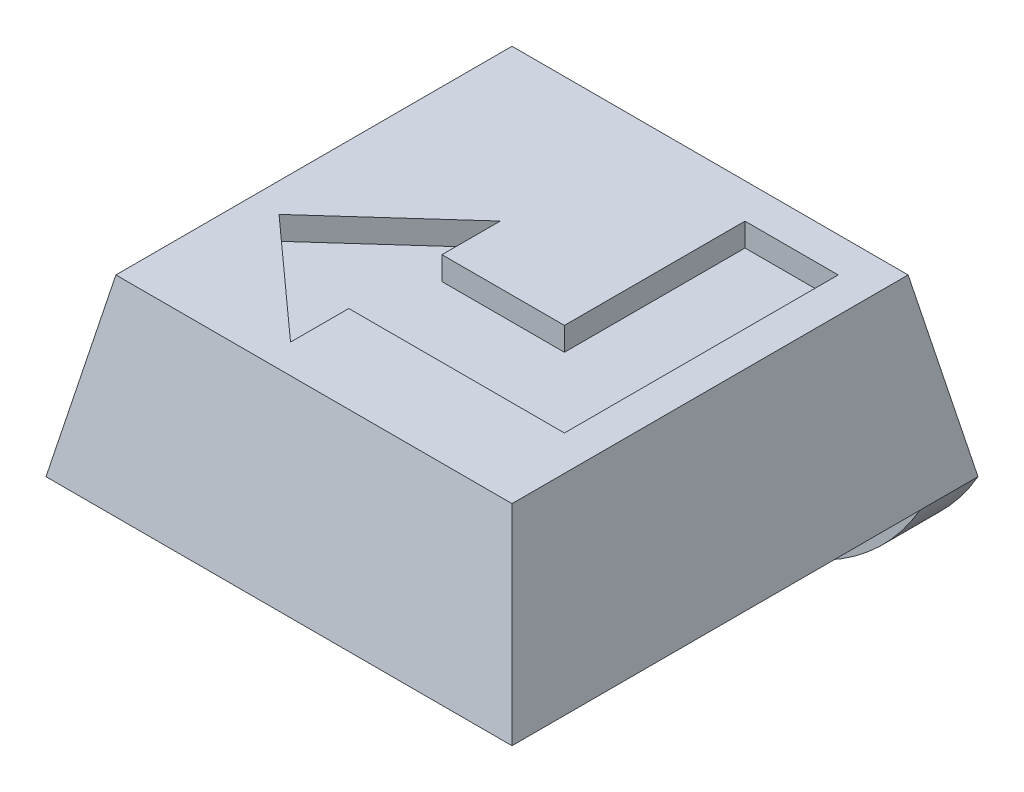
ISO-10303-21;
HEADER;
FILE_DESCRIPTION(('STEP AP214'),'2;1');
FILE_NAME('part.step','',(''),(''),'','','');
FILE_SCHEMA(('AUTOMOTIVE_DESIGN { 1 0 10303 214 1 1 1 1 }'));
ENDSEC;
DATA;
#1=APPLICATION_CONTEXT('core data for automotive mechanical design processes');
#2=APPLICATION_PROTOCOL_DEFINITION('international standard','automotive_design',2000,#1);
#3=PRODUCT_CONTEXT('',#1,'mechanical');
#4=PRODUCT('Part','Part','',(#3));
#5=PRODUCT_RELATED_PRODUCT_CATEGORY('part','',(#4));
#6=PRODUCT_DEFINITION_FORMATION('','',#4);
#7=PRODUCT_DEFINITION_CONTEXT('part definition',#1,'design');
#8=PRODUCT_DEFINITION('design','',#6,#7);
#9=PRODUCT_DEFINITION_SHAPE('','',#8);
#10=(LENGTH_UNIT() NAMED_UNIT(*) SI_UNIT(.MILLI.,.METRE.));
#11=(NAMED_UNIT(*) PLANE_ANGLE_UNIT() SI_UNIT($,.RADIAN.));
#12=(NAMED_UNIT(*) SI_UNIT($,.STERADIAN.) SOLID_ANGLE_UNIT());
#13=UNCERTAINTY_MEASURE_WITH_UNIT(LENGTH_MEASURE(1.E-05),#10,'distance_accuracy_value','');
#14=(GEOMETRIC_REPRESENTATION_CONTEXT(3) GLOBAL_UNCERTAINTY_ASSIGNED_CONTEXT((#13)) GLOBAL_UNIT_ASSIGNED_CONTEXT((#10,
#11,#12)) REPRESENTATION_CONTEXT('',''));
#15=CARTESIAN_POINT('',(0.,0.,0.));
#16=DIRECTION('',(0.,0.,1.));
#17=DIRECTION('',(1.,0.,0.));
#18=AXIS2_PLACEMENT_3D('',#15,#16,#17);
#19=CARTESIAN_POINT('',(0.,3.,0.));
#20=DIRECTION('',(0.,-1.,0.));
#21=DIRECTION('',(0.,0.,-1.));
#22=AXIS2_PLACEMENT_3D('',#19,#20,#21);
#23=PLANE('',#22);
#24=DIRECTION('',(-1.,0.,0.));
#25=VECTOR('',#24,1.);
#26=CARTESIAN_POINT('',(0.,3.,-2.1));
#27=LINE('',#26,#25);
#28=CARTESIAN_POINT('',(6.8,3.,-2.1));
#29=VERTEX_POINT('',#28);
#30=CARTESIAN_POINT('',(3.09782784027759,3.,-2.1));
#31=VERTEX_POINT('',#30);
#32=EDGE_CURVE('E239',#29,#31,#27,.T.);
#33=ORIENTED_EDGE('',*,*,#32,.T.);
#34=DIRECTION('',(0.,0.,-1.));
#35=VECTOR('',#34,1.);
#36=CARTESIAN_POINT('',(3.09782784027759,3.,0.));
#37=LINE('',#36,#35);
#38=CARTESIAN_POINT('',(3.09782784027759,3.,-1.1));
#39=VERTEX_POINT('',#38);
#40=EDGE_CURVE('E235',#39,#31,#37,.T.);
#41=ORIENTED_EDGE('',*,*,#40,.F.);
#42=DIRECTION('',(0.742932553355282,0.,0.669366283259772));
#43=VECTOR('',#42,1.);
#44=CARTESIAN_POINT('',(1.93500894894264,3.,-2.14767486076882));
#45=LINE('',#44,#43);
#46=CARTESIAN_POINT('',(1.1,3.,-2.9));
#47=VERTEX_POINT('',#46);
#48=EDGE_CURVE('E197',#47,#39,#45,.T.);
#49=ORIENTED_EDGE('',*,*,#48,.F.);
#50=DIRECTION('',(-0.742932553355282,0.,0.669366283259772));
#51=VECTOR('',#50,1.);
#52=CARTESIAN_POINT('',(-0.949296262379639,3.,-1.05362805647417));
#53=LINE('',#52,#51);
#54=CARTESIAN_POINT('',(3.09782784027759,3.,-4.7));
#55=VERTEX_POINT('',#54);
#56=EDGE_CURVE('E218',#55,#47,#53,.T.);
#57=ORIENTED_EDGE('',*,*,#56,.F.);
#58=CARTESIAN_POINT('',(3.09782784027759,3.,-3.7));
#59=VERTEX_POINT('',#58);
#60=EDGE_CURVE('E222',#59,#55,#37,.T.);
#61=ORIENTED_EDGE('',*,*,#60,.F.);
#62=DIRECTION('',(-1.,0.,0.));
#63=VECTOR('',#62,1.);
#64=CARTESIAN_POINT('',(0.,3.,-3.7));
#65=LINE('',#64,#63);
#66=CARTESIAN_POINT('',(5.2,3.,-3.7));
#67=VERTEX_POINT('',#66);
#68=EDGE_CURVE('E243',#67,#59,#65,.T.);
#69=ORIENTED_EDGE('',*,*,#68,.F.);
#70=DIRECTION('',(0.,0.,1.));
#71=VECTOR('',#70,1.);
#72=CARTESIAN_POINT('',(5.2,3.,-6.8));
#73=LINE('',#72,#71);
#74=CARTESIAN_POINT('',(5.2,3.,-6.8));
#75=VERTEX_POINT('',#74);
#76=EDGE_CURVE('E267',#75,#67,#73,.T.);
#77=ORIENTED_EDGE('',*,*,#76,.F.);
#78=DIRECTION('',(1.,0.,0.));
#79=VECTOR('',#78,1.);
#80=CARTESIAN_POINT('',(5.2,3.,-6.8));
#81=LINE('',#80,#79);
#82=CARTESIAN_POINT('',(6.8,3.,-6.8));
#83=VERTEX_POINT('',#82);
#84=EDGE_CURVE('E91',#75,#83,#81,.T.);
#85=ORIENTED_EDGE('',*,*,#84,.T.);
#86=DIRECTION('',(0.,0.,1.));
#87=VECTOR('',#86,1.);
#88=CARTESIAN_POINT('',(6.8,3.,-6.8));
#89=LINE('',#88,#87);
#90=EDGE_CURVE('E275',#83,#29,#89,.T.);
#91=ORIENTED_EDGE('',*,*,#90,.T.);
#92=EDGE_LOOP('',(#33,#41,#49,#57,#61,#69,#77,#85,#91));
#93=FACE_BOUND('',#92,.T.);
#94=DIRECTION('',(-1.,0.,0.));
#95=VECTOR('',#94,1.);
#96=CARTESIAN_POINT('',(11.,3.,-0.6));
#97=LINE('',#96,#95);
#98=CARTESIAN_POINT('',(7.4,3.,-0.6));
#99=VERTEX_POINT('',#98);
#100=CARTESIAN_POINT('',(0.6,3.,-0.6));
#101=VERTEX_POINT('',#100);
#102=EDGE_CURVE('E314',#99,#101,#97,.T.);
#103=ORIENTED_EDGE('',*,*,#102,.F.);
#104=DIRECTION('',(0.,0.,1.));
#105=VECTOR('',#104,1.);
#106=CARTESIAN_POINT('',(7.4,3.,-8.));
#107=LINE('',#106,#105);
#108=CARTESIAN_POINT('',(7.4,3.,-7.4));
#109=VERTEX_POINT('',#108);
#110=EDGE_CURVE('E327',#109,#99,#107,.T.);
#111=ORIENTED_EDGE('',*,*,#110,.F.);
#112=DIRECTION('',(-1.,0.,0.));
#113=VECTOR('',#112,1.);
#114=CARTESIAN_POINT('',(11.,3.,-7.4));
#115=LINE('',#114,#113);
#116=CARTESIAN_POINT('',(0.599999999999999,3.,-7.4));
#117=VERTEX_POINT('',#116);
#118=EDGE_CURVE('E310',#109,#117,#115,.T.);
#119=ORIENTED_EDGE('',*,*,#118,.T.);
#120=DIRECTION('',(0.,0.,1.));
#121=VECTOR('',#120,1.);
#122=CARTESIAN_POINT('',(0.6,3.,-8.));
#123=LINE('',#122,#121);
#124=EDGE_CURVE('E330',#117,#101,#123,.T.);
#125=ORIENTED_EDGE('',*,*,#124,.T.);
#126=EDGE_LOOP('',(#103,#111,#119,#125));
#127=FACE_BOUND('',#126,.T.);
#128=ADVANCED_FACE('F75',(#93,#127),#23,.F.);
#129=CARTESIAN_POINT('',(8.,0.,-8.));
#130=DIRECTION('',(-0.98058067569092,-0.196116135138184,0.));
#131=DIRECTION('',(0.196116135138184,-0.98058067569092,0.));
#132=AXIS2_PLACEMENT_3D('',#129,#130,#131);
#133=PLANE('',#132);
#134=DIRECTION('',(-0.192450089729875,0.962250448649376,-0.192450089729875));
#135=VECTOR('',#134,1.);
#136=CARTESIAN_POINT('',(7.7037037037037,1.48148148148148,-0.296296296296296));
#137=LINE('',#136,#135);
#138=CARTESIAN_POINT('',(8.,0.,0.));
#139=VERTEX_POINT('',#138);
#140=EDGE_CURVE('E324',#139,#99,#137,.T.);
#141=ORIENTED_EDGE('',*,*,#140,.F.);
#142=DIRECTION('',(0.,0.,-1.));
#143=VECTOR('',#142,1.);
#144=CARTESIAN_POINT('',(8.,0.,0.));
#145=LINE('',#144,#143);
#146=CARTESIAN_POINT('',(8.,0.,-7.));
#147=VERTEX_POINT('',#146);
#148=EDGE_CURVE('E343',#139,#147,#145,.T.);
#149=ORIENTED_EDGE('',*,*,#148,.T.);
#150=DIRECTION('',(0.,0.,1.));
#151=VECTOR('',#150,1.);
#152=CARTESIAN_POINT('',(8.,0.,-8.));
#153=LINE('',#152,#151);
#154=CARTESIAN_POINT('',(8.,0.,-8.));
#155=VERTEX_POINT('',#154);
#156=EDGE_CURVE('E250',#155,#147,#153,.T.);
#157=ORIENTED_EDGE('',*,*,#156,.F.);
#158=DIRECTION('',(0.192450089729875,-0.962250448649376,-0.192450089729875));
#159=VECTOR('',#158,1.);
#160=CARTESIAN_POINT('',(8.,0.,-8.));
#161=LINE('',#160,#159);
#162=EDGE_CURVE('E317',#109,#155,#161,.T.);
#163=ORIENTED_EDGE('',*,*,#162,.F.);
#164=ORIENTED_EDGE('',*,*,#110,.T.);
#165=EDGE_LOOP('',(#141,#149,#157,#163,#164));
#166=FACE_BOUND('',#165,.T.);
#167=ADVANCED_FACE('F411',(#166),#133,.F.);
#168=CARTESIAN_POINT('',(0.,0.,-8.));
#169=DIRECTION('',(0.98058067569092,-0.196116135138184,0.));
#170=DIRECTION('',(0.196116135138184,0.98058067569092,0.));
#171=AXIS2_PLACEMENT_3D('',#168,#169,#170);
#172=PLANE('',#171);
#173=DIRECTION('',(-0.192450089729875,-0.962250448649376,0.192450089729875));
#174=VECTOR('',#173,1.);
#175=CARTESIAN_POINT('',(0.296296296296296,1.48148148148148,-0.296296296296296));
#176=LINE('',#175,#174);
#177=CARTESIAN_POINT('',(0.,0.,0.));
#178=VERTEX_POINT('',#177);
#179=EDGE_CURVE('E371',#101,#178,#176,.T.);
#180=ORIENTED_EDGE('',*,*,#179,.F.);
#181=ORIENTED_EDGE('',*,*,#124,.F.);
#182=DIRECTION('',(0.192450089729875,0.962250448649376,0.192450089729875));
#183=VECTOR('',#182,1.);
#184=CARTESIAN_POINT('',(0.,0.,-8.));
#185=LINE('',#184,#183);
#186=CARTESIAN_POINT('',(0.,0.,-8.));
#187=VERTEX_POINT('',#186);
#188=EDGE_CURVE('E342',#187,#117,#185,.T.);
#189=ORIENTED_EDGE('',*,*,#188,.F.);
#190=DIRECTION('',(0.,0.,1.));
#191=VECTOR('',#190,1.);
#192=CARTESIAN_POINT('',(0.,0.,0.));
#193=LINE('',#192,#191);
#194=CARTESIAN_POINT('',(0.,0.,-7.));
#195=VERTEX_POINT('',#194);
#196=EDGE_CURVE('E347',#187,#195,#193,.T.);
#197=ORIENTED_EDGE('',*,*,#196,.T.);
#198=EDGE_CURVE('E334',#195,#178,#193,.T.);
#199=ORIENTED_EDGE('',*,*,#198,.T.);
#200=EDGE_LOOP('',(#180,#181,#189,#197,#199));
#201=FACE_BOUND('',#200,.T.);
#202=ADVANCED_FACE('F395',(#201),#172,.F.);
#203=CARTESIAN_POINT('',(0.,0.,0.));
#204=DIRECTION('',(0.,-1.,0.));
#205=DIRECTION('',(0.,0.,-1.));
#206=AXIS2_PLACEMENT_3D('',#203,#204,#205);
#207=PLANE('',#206);
#208=DIRECTION('',(-1.,0.,0.));
#209=VECTOR('',#208,1.);
#210=CARTESIAN_POINT('',(0.,0.,-7.));
#211=LINE('',#210,#209);
#212=EDGE_CURVE('E297',#147,#195,#211,.T.);
#213=ORIENTED_EDGE('',*,*,#212,.F.);
#214=ORIENTED_EDGE('',*,*,#148,.F.);
#215=DIRECTION('',(1.,0.,0.));
#216=VECTOR('',#215,1.);
#217=CARTESIAN_POINT('',(0.,0.,0.));
#218=LINE('',#217,#216);
#219=EDGE_CURVE('E344',#178,#139,#218,.T.);
#220=ORIENTED_EDGE('',*,*,#219,.F.);
#221=ORIENTED_EDGE('',*,*,#198,.F.);
#222=EDGE_LOOP('',(#213,#214,#220,#221));
#223=FACE_BOUND('',#222,.T.);
#224=CARTESIAN_POINT('',(4.,0.,-3.75));
#225=DIRECTION('',(0.,-1.,0.));
#226=DIRECTION('',(0.,0.,-1.));
#227=AXIS2_PLACEMENT_3D('',#224,#225,#226);
#228=CIRCLE('',#227,1.8);
#229=CARTESIAN_POINT('',(4.,0.,-5.55));
#230=VERTEX_POINT('',#229);
#231=EDGE_CURVE('E300',#230,#230,#228,.T.);
#232=ORIENTED_EDGE('',*,*,#231,.F.);
#233=EDGE_LOOP('',(#232));
#234=FACE_BOUND('',#233,.T.);
#235=ADVANCED_FACE('F406',(#223,#234),#207,.T.);
#236=CARTESIAN_POINT('',(11.,3.,-7.4));
#237=DIRECTION('',(0.,0.196116135138184,-0.98058067569092));
#238=DIRECTION('',(0.,0.98058067569092,0.196116135138184));
#239=AXIS2_PLACEMENT_3D('',#236,#237,#238);
#240=PLANE('',#239);
#241=ORIENTED_EDGE('',*,*,#162,.T.);
#242=DIRECTION('',(-1.,0.,0.));
#243=VECTOR('',#242,1.);
#244=CARTESIAN_POINT('',(0.,0.,-8.));
#245=LINE('',#244,#243);
#246=EDGE_CURVE('E338',#155,#187,#245,.T.);
#247=ORIENTED_EDGE('',*,*,#246,.T.);
#248=ORIENTED_EDGE('',*,*,#188,.T.);
#249=ORIENTED_EDGE('',*,*,#118,.F.);
#250=EDGE_LOOP('',(#241,#247,#248,#249));
#251=FACE_BOUND('',#250,.T.);
#252=ADVANCED_FACE('F390',(#251),#240,.T.);
#253=CARTESIAN_POINT('',(11.,0.,0.));
#254=DIRECTION('',(0.,0.196116135138184,0.98058067569092));
#255=DIRECTION('',(0.,-0.98058067569092,0.196116135138184));
#256=AXIS2_PLACEMENT_3D('',#253,#254,#255);
#257=PLANE('',#256);
#258=ORIENTED_EDGE('',*,*,#140,.T.);
#259=ORIENTED_EDGE('',*,*,#102,.T.);
#260=ORIENTED_EDGE('',*,*,#179,.T.);
#261=ORIENTED_EDGE('',*,*,#219,.T.);
#262=EDGE_LOOP('',(#258,#259,#260,#261));
#263=FACE_BOUND('',#262,.T.);
#264=ADVANCED_FACE('F437',(#263),#257,.T.);
#265=CARTESIAN_POINT('',(4.,0.8,-3.75));
#266=DIRECTION('',(0.,-1.,0.));
#267=DIRECTION('',(0.,0.,-1.));
#268=AXIS2_PLACEMENT_3D('',#265,#266,#267);
#269=CYLINDRICAL_SURFACE('',#268,1.8);
#270=CARTESIAN_POINT('',(4.,0.8,-3.75));
#271=DIRECTION('',(0.,-1.,0.));
#272=DIRECTION('',(0.,0.,-1.));
#273=AXIS2_PLACEMENT_3D('',#270,#271,#272);
#274=CIRCLE('',#273,1.8);
#275=CARTESIAN_POINT('',(4.,0.8,-5.55));
#276=VERTEX_POINT('',#275);
#277=EDGE_CURVE('E306',#276,#276,#274,.T.);
#278=ORIENTED_EDGE('',*,*,#277,.F.);
#279=EDGE_LOOP('',(#278));
#280=FACE_BOUND('',#279,.T.);
#281=ORIENTED_EDGE('',*,*,#231,.T.);
#282=EDGE_LOOP('',(#281));
#283=FACE_BOUND('',#282,.T.);
#284=ADVANCED_FACE('F444',(#280,#283),#269,.F.);
#285=CARTESIAN_POINT('',(4.,0.8,-3.75));
#286=DIRECTION('',(0.,-1.,0.));
#287=DIRECTION('',(0.,0.,-1.));
#288=AXIS2_PLACEMENT_3D('',#285,#286,#287);
#289=PLANE('',#288);
#290=ORIENTED_EDGE('',*,*,#277,.T.);
#291=EDGE_LOOP('',(#290));
#292=FACE_BOUND('',#291,.T.);
#293=ADVANCED_FACE('F448',(#292),#289,.T.);
#294=CARTESIAN_POINT('',(0.,-2.,-8.));
#295=DIRECTION('',(0.,0.,1.));
#296=DIRECTION('',(1.,0.,0.));
#297=AXIS2_PLACEMENT_3D('',#294,#295,#296);
#298=PLANE('',#297);
#299=ORIENTED_EDGE('',*,*,#246,.F.);
#300=CARTESIAN_POINT('',(4.53589838486225,2.,-8.));
#301=DIRECTION('',(0.,0.,1.));
#302=DIRECTION('',(1.,0.,0.));
#303=AXIS2_PLACEMENT_3D('',#300,#301,#302);
#304=CIRCLE('',#303,4.);
#305=CARTESIAN_POINT('',(4.53589838486225,-2.,-8.));
#306=VERTEX_POINT('',#305);
#307=EDGE_CURVE('E12',#155,#306,#304,.F.);
#308=ORIENTED_EDGE('',*,*,#307,.T.);
#309=DIRECTION('',(1.,0.,0.));
#310=VECTOR('',#309,1.);
#311=CARTESIAN_POINT('',(0.,-2.,-8.));
#312=LINE('',#311,#310);
#313=CARTESIAN_POINT('',(3.46410161513775,-2.,-8.));
#314=VERTEX_POINT('',#313);
#315=EDGE_CURVE('E292',#314,#306,#312,.T.);
#316=ORIENTED_EDGE('',*,*,#315,.F.);
#317=CARTESIAN_POINT('',(3.46410161513775,2.,-8.));
#318=DIRECTION('',(0.,0.,1.));
#319=DIRECTION('',(1.,0.,0.));
#320=AXIS2_PLACEMENT_3D('',#317,#318,#319);
#321=CIRCLE('',#320,4.);
#322=EDGE_CURVE('E84',#314,#187,#321,.F.);
#323=ORIENTED_EDGE('',*,*,#322,.T.);
#324=EDGE_LOOP('',(#299,#308,#316,#323));
#325=FACE_BOUND('',#324,.T.);
#326=ADVANCED_FACE('F383',(#325),#298,.F.);
#327=CARTESIAN_POINT('',(0.,-2.,-7.));
#328=DIRECTION('',(0.,0.,-1.));
#329=DIRECTION('',(-1.,0.,0.));
#330=AXIS2_PLACEMENT_3D('',#327,#328,#329);
#331=PLANE('',#330);
#332=DIRECTION('',(-1.,0.,0.));
#333=VECTOR('',#332,1.);
#334=CARTESIAN_POINT('',(0.,-2.,-7.));
#335=LINE('',#334,#333);
#336=CARTESIAN_POINT('',(4.53589838486225,-2.,-7.));
#337=VERTEX_POINT('',#336);
#338=CARTESIAN_POINT('',(3.46410161513775,-2.,-7.));
#339=VERTEX_POINT('',#338);
#340=EDGE_CURVE('E296',#337,#339,#335,.T.);
#341=ORIENTED_EDGE('',*,*,#340,.F.);
#342=CARTESIAN_POINT('',(4.53589838486225,2.,-7.));
#343=DIRECTION('',(0.,0.,-1.));
#344=DIRECTION('',(-1.,0.,0.));
#345=AXIS2_PLACEMENT_3D('',#342,#343,#344);
#346=CIRCLE('',#345,4.);
#347=EDGE_CURVE('E377',#337,#147,#346,.F.);
#348=ORIENTED_EDGE('',*,*,#347,.T.);
#349=ORIENTED_EDGE('',*,*,#212,.T.);
#350=CARTESIAN_POINT('',(3.46410161513775,2.,-7.));
#351=DIRECTION('',(0.,0.,-1.));
#352=DIRECTION('',(-1.,0.,0.));
#353=AXIS2_PLACEMENT_3D('',#350,#351,#352);
#354=CIRCLE('',#353,4.);
#355=EDGE_CURVE('E99',#195,#339,#354,.F.);
#356=ORIENTED_EDGE('',*,*,#355,.T.);
#357=EDGE_LOOP('',(#341,#348,#349,#356));
#358=FACE_BOUND('',#357,.T.);
#359=ADVANCED_FACE('F401',(#358),#331,.F.);
#360=CARTESIAN_POINT('',(0.,-2.,0.));
#361=DIRECTION('',(0.,1.,0.));
#362=DIRECTION('',(0.,0.,1.));
#363=AXIS2_PLACEMENT_3D('',#360,#361,#362);
#364=PLANE('',#363);
#365=ORIENTED_EDGE('',*,*,#315,.T.);
#366=DIRECTION('',(0.,0.,1.));
#367=VECTOR('',#366,1.);
#368=CARTESIAN_POINT('',(4.53589838486225,-2.,0.));
#369=LINE('',#368,#367);
#370=EDGE_CURVE('E370',#306,#337,#369,.T.);
#371=ORIENTED_EDGE('',*,*,#370,.T.);
#372=ORIENTED_EDGE('',*,*,#340,.T.);
#373=DIRECTION('',(0.,0.,-1.));
#374=VECTOR('',#373,1.);
#375=CARTESIAN_POINT('',(3.46410161513775,-2.,0.));
#376=LINE('',#375,#374);
#377=EDGE_CURVE('E366',#339,#314,#376,.T.);
#378=ORIENTED_EDGE('',*,*,#377,.T.);
#379=EDGE_LOOP('',(#365,#371,#372,#378));
#380=FACE_BOUND('',#379,.T.);
#381=ADVANCED_FACE('F399',(#380),#364,.F.);
#382=CARTESIAN_POINT('',(4.53589838486225,2.,-8.));
#383=DIRECTION('',(0.,0.,1.));
#384=DIRECTION('',(1.,0.,0.));
#385=AXIS2_PLACEMENT_3D('',#382,#383,#384);
#386=CYLINDRICAL_SURFACE('',#385,4.);
#387=ORIENTED_EDGE('',*,*,#307,.F.);
#388=ORIENTED_EDGE('',*,*,#156,.T.);
#389=ORIENTED_EDGE('',*,*,#347,.F.);
#390=ORIENTED_EDGE('',*,*,#370,.F.);
#391=EDGE_LOOP('',(#387,#388,#389,#390));
#392=FACE_BOUND('',#391,.T.);
#393=ADVANCED_FACE('F412',(#392),#386,.T.);
#394=CARTESIAN_POINT('',(3.46410161513775,2.,-8.));
#395=DIRECTION('',(0.,0.,-1.));
#396=DIRECTION('',(-1.,0.,0.));
#397=AXIS2_PLACEMENT_3D('',#394,#395,#396);
#398=CYLINDRICAL_SURFACE('',#397,4.);
#399=ORIENTED_EDGE('',*,*,#355,.F.);
#400=ORIENTED_EDGE('',*,*,#196,.F.);
#401=ORIENTED_EDGE('',*,*,#322,.F.);
#402=ORIENTED_EDGE('',*,*,#377,.F.);
#403=EDGE_LOOP('',(#399,#400,#401,#402));
#404=FACE_BOUND('',#403,.T.);
#405=ADVANCED_FACE('F77',(#404),#398,.T.);
#406=CARTESIAN_POINT('',(1.93500894894264,2.6,-2.14767486076882));
#407=DIRECTION('',(-0.669366283259772,0.,0.742932553355282));
#408=DIRECTION('',(0.742932553355282,0.,0.669366283259772));
#409=AXIS2_PLACEMENT_3D('',#406,#407,#408);
#410=PLANE('',#409);
#411=ORIENTED_EDGE('',*,*,#48,.T.);
#412=DIRECTION('',(0.,1.,0.));
#413=VECTOR('',#412,1.);
#414=CARTESIAN_POINT('',(3.09782784027759,2.6,-1.1));
#415=LINE('',#414,#413);
#416=CARTESIAN_POINT('',(3.09782784027759,2.6,-1.1));
#417=VERTEX_POINT('',#416);
#418=EDGE_CURVE('E190',#417,#39,#415,.T.);
#419=ORIENTED_EDGE('',*,*,#418,.F.);
#420=DIRECTION('',(0.742932553355282,0.,0.669366283259772));
#421=VECTOR('',#420,1.);
#422=CARTESIAN_POINT('',(1.93500894894264,2.6,-2.14767486076882));
#423=LINE('',#422,#421);
#424=CARTESIAN_POINT('',(1.1,2.6,-2.9));
#425=VERTEX_POINT('',#424);
#426=EDGE_CURVE('E194',#425,#417,#423,.T.);
#427=ORIENTED_EDGE('',*,*,#426,.F.);
#428=DIRECTION('',(0.,1.,0.));
#429=VECTOR('',#428,1.);
#430=CARTESIAN_POINT('',(1.1,2.6,-2.9));
#431=LINE('',#430,#429);
#432=EDGE_CURVE('E247',#425,#47,#431,.T.);
#433=ORIENTED_EDGE('',*,*,#432,.T.);
#434=EDGE_LOOP('',(#411,#419,#427,#433));
#435=FACE_BOUND('',#434,.T.);
#436=ADVANCED_FACE('F192',(#435),#410,.F.);
#437=CARTESIAN_POINT('',(-0.949296262379639,2.6,-1.05362805647417));
#438=DIRECTION('',(-0.669366283259772,0.,-0.742932553355282));
#439=DIRECTION('',(-0.742932553355282,0.,0.669366283259772));
#440=AXIS2_PLACEMENT_3D('',#437,#438,#439);
#441=PLANE('',#440);
#442=ORIENTED_EDGE('',*,*,#56,.T.);
#443=ORIENTED_EDGE('',*,*,#432,.F.);
#444=DIRECTION('',(-0.742932553355282,0.,0.669366283259772));
#445=VECTOR('',#444,1.);
#446=CARTESIAN_POINT('',(-0.949296262379639,2.6,-1.05362805647417));
#447=LINE('',#446,#445);
#448=CARTESIAN_POINT('',(3.09782784027759,2.6,-4.7));
#449=VERTEX_POINT('',#448);
#450=EDGE_CURVE('E203',#449,#425,#447,.T.);
#451=ORIENTED_EDGE('',*,*,#450,.F.);
#452=DIRECTION('',(0.,1.,0.));
#453=VECTOR('',#452,1.);
#454=CARTESIAN_POINT('',(3.09782784027759,2.6,-4.7));
#455=LINE('',#454,#453);
#456=EDGE_CURVE('E251',#449,#55,#455,.T.);
#457=ORIENTED_EDGE('',*,*,#456,.T.);
#458=EDGE_LOOP('',(#442,#443,#451,#457));
#459=FACE_BOUND('',#458,.T.);
#460=ADVANCED_FACE('F469',(#459),#441,.F.);
#461=CARTESIAN_POINT('',(3.09782784027759,2.6,0.));
#462=DIRECTION('',(1.,0.,0.));
#463=DIRECTION('',(0.,0.,-1.));
#464=AXIS2_PLACEMENT_3D('',#461,#462,#463);
#465=PLANE('',#464);
#466=ORIENTED_EDGE('',*,*,#60,.T.);
#467=ORIENTED_EDGE('',*,*,#456,.F.);
#468=DIRECTION('',(0.,0.,-1.));
#469=VECTOR('',#468,1.);
#470=CARTESIAN_POINT('',(3.09782784027759,2.6,0.));
#471=LINE('',#470,#469);
#472=CARTESIAN_POINT('',(3.09782784027759,2.6,-3.7));
#473=VERTEX_POINT('',#472);
#474=EDGE_CURVE('E213',#473,#449,#471,.T.);
#475=ORIENTED_EDGE('',*,*,#474,.F.);
#476=DIRECTION('',(0.,1.,0.));
#477=VECTOR('',#476,1.);
#478=CARTESIAN_POINT('',(3.09782784027759,2.6,-3.7));
#479=LINE('',#478,#477);
#480=EDGE_CURVE('E254',#473,#59,#479,.T.);
#481=ORIENTED_EDGE('',*,*,#480,.T.);
#482=EDGE_LOOP('',(#466,#467,#475,#481));
#483=FACE_BOUND('',#482,.T.);
#484=ADVANCED_FACE('F477',(#483),#465,.F.);
#485=CARTESIAN_POINT('',(0.,2.6,-3.7));
#486=DIRECTION('',(0.,0.,-1.));
#487=DIRECTION('',(-1.,0.,0.));
#488=AXIS2_PLACEMENT_3D('',#485,#486,#487);
#489=PLANE('',#488);
#490=ORIENTED_EDGE('',*,*,#68,.T.);
#491=ORIENTED_EDGE('',*,*,#480,.F.);
#492=DIRECTION('',(-1.,0.,0.));
#493=VECTOR('',#492,1.);
#494=CARTESIAN_POINT('',(0.,2.6,-3.7));
#495=LINE('',#494,#493);
#496=CARTESIAN_POINT('',(5.2,2.6,-3.7));
#497=VERTEX_POINT('',#496);
#498=EDGE_CURVE('E227',#497,#473,#495,.T.);
#499=ORIENTED_EDGE('',*,*,#498,.F.);
#500=DIRECTION('',(0.,1.,0.));
#501=VECTOR('',#500,1.);
#502=CARTESIAN_POINT('',(5.2,2.6,-3.7));
#503=LINE('',#502,#501);
#504=EDGE_CURVE('E257',#497,#67,#503,.T.);
#505=ORIENTED_EDGE('',*,*,#504,.T.);
#506=EDGE_LOOP('',(#490,#491,#499,#505));
#507=FACE_BOUND('',#506,.T.);
#508=ADVANCED_FACE('F473',(#507),#489,.F.);
#509=CARTESIAN_POINT('',(0.,2.6,-2.1));
#510=DIRECTION('',(0.,0.,-1.));
#511=DIRECTION('',(-1.,0.,0.));
#512=AXIS2_PLACEMENT_3D('',#509,#510,#511);
#513=PLANE('',#512);
#514=ORIENTED_EDGE('',*,*,#32,.F.);
#515=DIRECTION('',(0.,1.,0.));
#516=VECTOR('',#515,1.);
#517=CARTESIAN_POINT('',(6.8,2.6,-2.1));
#518=LINE('',#517,#516);
#519=CARTESIAN_POINT('',(6.8,2.6,-2.1));
#520=VERTEX_POINT('',#519);
#521=EDGE_CURVE('E274',#520,#29,#518,.T.);
#522=ORIENTED_EDGE('',*,*,#521,.F.);
#523=DIRECTION('',(-1.,0.,0.));
#524=VECTOR('',#523,1.);
#525=CARTESIAN_POINT('',(0.,2.6,-2.1));
#526=LINE('',#525,#524);
#527=CARTESIAN_POINT('',(3.09782784027759,2.6,-2.1));
#528=VERTEX_POINT('',#527);
#529=EDGE_CURVE('E211',#520,#528,#526,.T.);
#530=ORIENTED_EDGE('',*,*,#529,.T.);
#531=DIRECTION('',(0.,1.,0.));
#532=VECTOR('',#531,1.);
#533=CARTESIAN_POINT('',(3.09782784027759,2.6,-2.1));
#534=LINE('',#533,#532);
#535=EDGE_CURVE('E202',#528,#31,#534,.T.);
#536=ORIENTED_EDGE('',*,*,#535,.T.);
#537=EDGE_LOOP('',(#514,#522,#530,#536));
#538=FACE_BOUND('',#537,.T.);
#539=ADVANCED_FACE('F470',(#538),#513,.T.);
#540=ORIENTED_EDGE('',*,*,#40,.T.);
#541=ORIENTED_EDGE('',*,*,#535,.F.);
#542=EDGE_CURVE('E207',#417,#528,#471,.T.);
#543=ORIENTED_EDGE('',*,*,#542,.F.);
#544=ORIENTED_EDGE('',*,*,#418,.T.);
#545=EDGE_LOOP('',(#540,#541,#543,#544));
#546=FACE_BOUND('',#545,.T.);
#547=ADVANCED_FACE('F208',(#546),#465,.F.);
#548=CARTESIAN_POINT('',(0.,2.6,0.));
#549=DIRECTION('',(0.,1.,0.));
#550=DIRECTION('',(0.,0.,1.));
#551=AXIS2_PLACEMENT_3D('',#548,#549,#550);
#552=PLANE('',#551);
#553=ORIENTED_EDGE('',*,*,#426,.T.);
#554=ORIENTED_EDGE('',*,*,#542,.T.);
#555=ORIENTED_EDGE('',*,*,#529,.F.);
#556=DIRECTION('',(0.,0.,1.));
#557=VECTOR('',#556,1.);
#558=CARTESIAN_POINT('',(6.8,2.6,-6.8));
#559=LINE('',#558,#557);
#560=CARTESIAN_POINT('',(6.8,2.6,-6.8));
#561=VERTEX_POINT('',#560);
#562=EDGE_CURVE('E262',#561,#520,#559,.T.);
#563=ORIENTED_EDGE('',*,*,#562,.F.);
#564=DIRECTION('',(1.,0.,0.));
#565=VECTOR('',#564,1.);
#566=CARTESIAN_POINT('',(5.2,2.6,-6.8));
#567=LINE('',#566,#565);
#568=CARTESIAN_POINT('',(5.2,2.6,-6.8));
#569=VERTEX_POINT('',#568);
#570=EDGE_CURVE('E266',#569,#561,#567,.T.);
#571=ORIENTED_EDGE('',*,*,#570,.F.);
#572=DIRECTION('',(0.,0.,1.));
#573=VECTOR('',#572,1.);
#574=CARTESIAN_POINT('',(5.2,2.6,-6.8));
#575=LINE('',#574,#573);
#576=EDGE_CURVE('E270',#569,#497,#575,.T.);
#577=ORIENTED_EDGE('',*,*,#576,.T.);
#578=ORIENTED_EDGE('',*,*,#498,.T.);
#579=ORIENTED_EDGE('',*,*,#474,.T.);
#580=ORIENTED_EDGE('',*,*,#450,.T.);
#581=EDGE_LOOP('',(#553,#554,#555,#563,#571,#577,#578,#579,#580));
#582=FACE_BOUND('',#581,.T.);
#583=ADVANCED_FACE('F214',(#582),#552,.T.);
#584=CARTESIAN_POINT('',(6.8,2.6,-6.8));
#585=DIRECTION('',(-1.,0.,0.));
#586=DIRECTION('',(0.,0.,1.));
#587=AXIS2_PLACEMENT_3D('',#584,#585,#586);
#588=PLANE('',#587);
#589=ORIENTED_EDGE('',*,*,#90,.F.);
#590=DIRECTION('',(0.,1.,0.));
#591=VECTOR('',#590,1.);
#592=CARTESIAN_POINT('',(6.8,2.6,-6.8));
#593=LINE('',#592,#591);
#594=EDGE_CURVE('E286',#561,#83,#593,.T.);
#595=ORIENTED_EDGE('',*,*,#594,.F.);
#596=ORIENTED_EDGE('',*,*,#562,.T.);
#597=ORIENTED_EDGE('',*,*,#521,.T.);
#598=EDGE_LOOP('',(#589,#595,#596,#597));
#599=FACE_BOUND('',#598,.T.);
#600=ADVANCED_FACE('F457',(#599),#588,.T.);
#601=CARTESIAN_POINT('',(5.2,2.6,-6.8));
#602=DIRECTION('',(0.,0.,1.));
#603=DIRECTION('',(1.,0.,0.));
#604=AXIS2_PLACEMENT_3D('',#601,#602,#603);
#605=PLANE('',#604);
#606=ORIENTED_EDGE('',*,*,#84,.F.);
#607=DIRECTION('',(0.,1.,0.));
#608=VECTOR('',#607,1.);
#609=CARTESIAN_POINT('',(5.2,2.6,-6.8));
#610=LINE('',#609,#608);
#611=EDGE_CURVE('E236',#569,#75,#610,.T.);
#612=ORIENTED_EDGE('',*,*,#611,.F.);
#613=ORIENTED_EDGE('',*,*,#570,.T.);
#614=ORIENTED_EDGE('',*,*,#594,.T.);
#615=EDGE_LOOP('',(#606,#612,#613,#614));
#616=FACE_BOUND('',#615,.T.);
#617=ADVANCED_FACE('F460',(#616),#605,.T.);
#618=CARTESIAN_POINT('',(5.2,2.6,-6.8));
#619=DIRECTION('',(-1.,0.,0.));
#620=DIRECTION('',(0.,0.,1.));
#621=AXIS2_PLACEMENT_3D('',#618,#619,#620);
#622=PLANE('',#621);
#623=ORIENTED_EDGE('',*,*,#576,.F.);
#624=ORIENTED_EDGE('',*,*,#611,.T.);
#625=ORIENTED_EDGE('',*,*,#76,.T.);
#626=ORIENTED_EDGE('',*,*,#504,.F.);
#627=EDGE_LOOP('',(#623,#624,#625,#626));
#628=FACE_BOUND('',#627,.T.);
#629=ADVANCED_FACE('F418',(#628),#622,.F.);
#630=CLOSED_SHELL('',(#128,#167,#202,#235,#252,#264,#284,#293,#326,#359,#381,#393,#405,#436,
#460,#484,#508,#539,#547,#583,#600,#617,#629));
#631=MANIFOLD_SOLID_BREP('B2',#630);
#632=ADVANCED_BREP_SHAPE_REPRESENTATION('',(#18,#631),#14);
#633=SHAPE_DEFINITION_REPRESENTATION(#9,#632);
ENDSEC;
END-ISO-10303-21;
